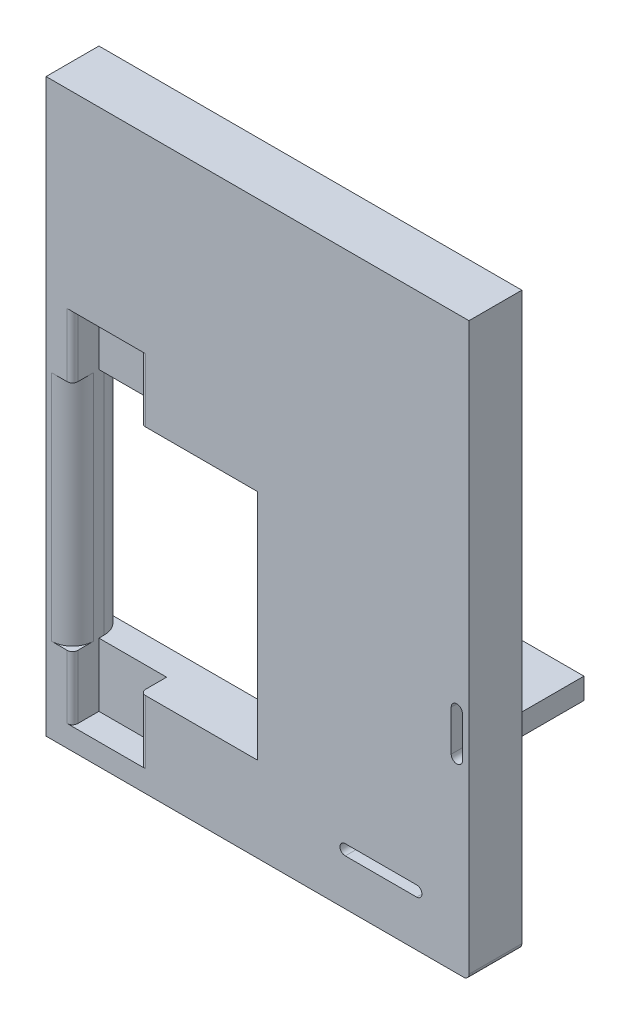
ISO-10303-21;
HEADER;
FILE_DESCRIPTION(('STEP AP214'),'2;1');
FILE_NAME('part.step','',(''),(''),'','','');
FILE_SCHEMA(('AUTOMOTIVE_DESIGN { 1 0 10303 214 1 1 1 1 }'));
ENDSEC;
DATA;
#1=APPLICATION_CONTEXT('core data for automotive mechanical design processes');
#2=APPLICATION_PROTOCOL_DEFINITION('international standard','automotive_design',2000,#1);
#3=PRODUCT_CONTEXT('',#1,'mechanical');
#4=PRODUCT('Part','Part','',(#3));
#5=PRODUCT_RELATED_PRODUCT_CATEGORY('part','',(#4));
#6=PRODUCT_DEFINITION_FORMATION('','',#4);
#7=PRODUCT_DEFINITION_CONTEXT('part definition',#1,'design');
#8=PRODUCT_DEFINITION('design','',#6,#7);
#9=PRODUCT_DEFINITION_SHAPE('','',#8);
#10=(LENGTH_UNIT() NAMED_UNIT(*) SI_UNIT(.MILLI.,.METRE.));
#11=(NAMED_UNIT(*) PLANE_ANGLE_UNIT() SI_UNIT($,.RADIAN.));
#12=(NAMED_UNIT(*) SI_UNIT($,.STERADIAN.) SOLID_ANGLE_UNIT());
#13=UNCERTAINTY_MEASURE_WITH_UNIT(LENGTH_MEASURE(1.E-05),#10,'distance_accuracy_value','');
#14=(GEOMETRIC_REPRESENTATION_CONTEXT(3) GLOBAL_UNCERTAINTY_ASSIGNED_CONTEXT((#13)) GLOBAL_UNIT_ASSIGNED_CONTEXT((#10,
#11,#12)) REPRESENTATION_CONTEXT('',''));
#15=CARTESIAN_POINT('',(0.,0.,0.));
#16=DIRECTION('',(0.,0.,1.));
#17=DIRECTION('',(1.,0.,0.));
#18=AXIS2_PLACEMENT_3D('',#15,#16,#17);
#19=CARTESIAN_POINT('',(0.,0.,0.));
#20=DIRECTION('',(0.,0.,-1.));
#21=DIRECTION('',(-1.,0.,0.));
#22=AXIS2_PLACEMENT_3D('',#19,#20,#21);
#23=PLANE('',#22);
#24=CARTESIAN_POINT('',(75.2670888522956,-125.945469049431,0.));
#25=DIRECTION('',(0.,0.,-1.));
#26=DIRECTION('',(-1.,0.,0.));
#27=AXIS2_PLACEMENT_3D('',#24,#25,#26);
#28=CIRCLE('',#27,2.5);
#29=CARTESIAN_POINT('',(75.2670888522956,-123.445469049431,0.));
#30=VERTEX_POINT('',#29);
#31=CARTESIAN_POINT('',(75.2670888522956,-128.445469049431,0.));
#32=VERTEX_POINT('',#31);
#33=EDGE_CURVE('E61',#30,#32,#28,.T.);
#34=ORIENTED_EDGE('',*,*,#33,.F.);
#35=DIRECTION('',(1.,0.,0.));
#36=VECTOR('',#35,1.);
#37=CARTESIAN_POINT('',(75.2670888522956,-123.445469049431,0.));
#38=LINE('',#37,#36);
#39=CARTESIAN_POINT('',(41.4919387106455,-123.445469049431,0.));
#40=VERTEX_POINT('',#39);
#41=EDGE_CURVE('E293',#40,#30,#38,.T.);
#42=ORIENTED_EDGE('',*,*,#41,.F.);
#43=CARTESIAN_POINT('',(41.4919387106455,-125.945469049431,0.));
#44=DIRECTION('',(0.,0.,-1.));
#45=DIRECTION('',(-1.,0.,0.));
#46=AXIS2_PLACEMENT_3D('',#43,#44,#45);
#47=CIRCLE('',#46,2.5);
#48=CARTESIAN_POINT('',(41.4919387106455,-128.445469049431,0.));
#49=VERTEX_POINT('',#48);
#50=EDGE_CURVE('E276',#49,#40,#47,.T.);
#51=ORIENTED_EDGE('',*,*,#50,.F.);
#52=DIRECTION('',(-1.,0.,0.));
#53=VECTOR('',#52,1.);
#54=CARTESIAN_POINT('',(75.2670888522956,-128.445469049431,0.));
#55=LINE('',#54,#53);
#56=EDGE_CURVE('E286',#32,#49,#55,.T.);
#57=ORIENTED_EDGE('',*,*,#56,.F.);
#58=EDGE_LOOP('',(#34,#42,#51,#57));
#59=FACE_BOUND('',#58,.T.);
#60=CARTESIAN_POINT('',(94.2568313407574,-42.4693194311734,0.));
#61=DIRECTION('',(0.,0.,-1.));
#62=DIRECTION('',(-1.,0.,0.));
#63=AXIS2_PLACEMENT_3D('',#60,#61,#62);
#64=CIRCLE('',#63,2.6592924538406);
#65=CARTESIAN_POINT('',(91.5975388869168,-42.4693194311734,0.));
#66=VERTEX_POINT('',#65);
#67=CARTESIAN_POINT('',(96.916123794598,-42.4693194311734,0.));
#68=VERTEX_POINT('',#67);
#69=EDGE_CURVE('E303',#66,#68,#64,.T.);
#70=ORIENTED_EDGE('',*,*,#69,.F.);
#71=DIRECTION('',(0.,1.,0.));
#72=VECTOR('',#71,1.);
#73=CARTESIAN_POINT('',(91.5975388869168,-42.4693194311734,0.));
#74=LINE('',#73,#72);
#75=CARTESIAN_POINT('',(91.5975388869168,-61.7491897215178,0.));
#76=VERTEX_POINT('',#75);
#77=EDGE_CURVE('E318',#76,#66,#74,.T.);
#78=ORIENTED_EDGE('',*,*,#77,.F.);
#79=CARTESIAN_POINT('',(94.2568313407574,-61.7491897215178,0.));
#80=DIRECTION('',(0.,0.,-1.));
#81=DIRECTION('',(-1.,0.,0.));
#82=AXIS2_PLACEMENT_3D('',#79,#80,#81);
#83=CIRCLE('',#82,2.6592924538406);
#84=CARTESIAN_POINT('',(96.916123794598,-61.7491897215178,0.));
#85=VERTEX_POINT('',#84);
#86=EDGE_CURVE('E314',#85,#76,#83,.T.);
#87=ORIENTED_EDGE('',*,*,#86,.F.);
#88=DIRECTION('',(0.,-1.,0.));
#89=VECTOR('',#88,1.);
#90=CARTESIAN_POINT('',(96.916123794598,-42.4693194311734,0.));
#91=LINE('',#90,#89);
#92=EDGE_CURVE('E310',#68,#85,#91,.T.);
#93=ORIENTED_EDGE('',*,*,#92,.F.);
#94=EDGE_LOOP('',(#70,#78,#87,#93));
#95=FACE_BOUND('',#94,.T.);
#96=DIRECTION('',(0.,-1.,0.));
#97=VECTOR('',#96,1.);
#98=CARTESIAN_POINT('',(-97.5,-110.,0.));
#99=LINE('',#98,#97);
#100=CARTESIAN_POINT('',(-97.5,0.,0.));
#101=VERTEX_POINT('',#100);
#102=CARTESIAN_POINT('',(-97.5,-110.,0.));
#103=VERTEX_POINT('',#102);
#104=EDGE_CURVE('E539',#101,#103,#99,.T.);
#105=ORIENTED_EDGE('',*,*,#104,.T.);
#106=DIRECTION('',(1.,0.,0.));
#107=VECTOR('',#106,1.);
#108=CARTESIAN_POINT('',(0.,-110.,0.));
#109=LINE('',#108,#107);
#110=CARTESIAN_POINT('',(0.,-110.,0.));
#111=VERTEX_POINT('',#110);
#112=EDGE_CURVE('E464',#103,#111,#109,.T.);
#113=ORIENTED_EDGE('',*,*,#112,.T.);
#114=DIRECTION('',(0.,1.,0.));
#115=VECTOR('',#114,1.);
#116=CARTESIAN_POINT('',(0.,0.,0.));
#117=LINE('',#116,#115);
#118=CARTESIAN_POINT('',(0.,0.,0.));
#119=VERTEX_POINT('',#118);
#120=EDGE_CURVE('E456',#111,#119,#117,.T.);
#121=ORIENTED_EDGE('',*,*,#120,.T.);
#122=DIRECTION('',(-1.,0.,0.));
#123=VECTOR('',#122,1.);
#124=CARTESIAN_POINT('',(0.,0.,0.));
#125=LINE('',#124,#123);
#126=EDGE_CURVE('E460',#119,#101,#125,.T.);
#127=ORIENTED_EDGE('',*,*,#126,.T.);
#128=EDGE_LOOP('',(#105,#113,#121,#127));
#129=FACE_BOUND('',#128,.T.);
#130=DIRECTION('',(0.,1.,0.));
#131=VECTOR('',#130,1.);
#132=CARTESIAN_POINT('',(100.,-120.,0.));
#133=LINE('',#132,#131);
#134=CARTESIAN_POINT('',(100.,-147.664162566349,0.));
#135=VERTEX_POINT('',#134);
#136=CARTESIAN_POINT('',(100.,120.,0.));
#137=VERTEX_POINT('',#136);
#138=EDGE_CURVE('E500',#135,#137,#133,.T.);
#139=ORIENTED_EDGE('',*,*,#138,.F.);
#140=CARTESIAN_POINT('',(97.5,-147.664162566349,0.));
#141=DIRECTION('',(0.,0.,-1.));
#142=DIRECTION('',(-1.,0.,0.));
#143=AXIS2_PLACEMENT_3D('',#140,#141,#142);
#144=CIRCLE('',#143,2.5);
#145=CARTESIAN_POINT('',(97.5,-150.164162566349,0.));
#146=VERTEX_POINT('',#145);
#147=EDGE_CURVE('E591',#135,#146,#144,.T.);
#148=ORIENTED_EDGE('',*,*,#147,.T.);
#149=DIRECTION('',(1.,0.,0.));
#150=VECTOR('',#149,1.);
#151=CARTESIAN_POINT('',(-100.,-150.164162566349,0.));
#152=LINE('',#151,#150);
#153=CARTESIAN_POINT('',(-100.,-150.164162566349,0.));
#154=VERTEX_POINT('',#153);
#155=EDGE_CURVE('E444',#154,#146,#152,.T.);
#156=ORIENTED_EDGE('',*,*,#155,.F.);
#157=DIRECTION('',(0.,1.,0.));
#158=VECTOR('',#157,1.);
#159=CARTESIAN_POINT('',(-100.,-120.,0.));
#160=LINE('',#159,#158);
#161=CARTESIAN_POINT('',(-100.,120.,0.));
#162=VERTEX_POINT('',#161);
#163=EDGE_CURVE('E511',#154,#162,#160,.T.);
#164=ORIENTED_EDGE('',*,*,#163,.T.);
#165=DIRECTION('',(-1.,0.,0.));
#166=VECTOR('',#165,1.);
#167=CARTESIAN_POINT('',(100.,120.,0.));
#168=LINE('',#167,#166);
#169=EDGE_CURVE('E484',#137,#162,#168,.T.);
#170=ORIENTED_EDGE('',*,*,#169,.F.);
#171=EDGE_LOOP('',(#139,#148,#156,#164,#170));
#172=FACE_BOUND('',#171,.T.);
#173=DIRECTION('',(-1.,0.,0.));
#174=VECTOR('',#173,1.);
#175=CARTESIAN_POINT('',(89.3674545266771,-73.3939838192922,0.));
#176=LINE('',#175,#174);
#177=CARTESIAN_POINT('',(89.3674545266771,-73.3939838192922,0.));
#178=VERTEX_POINT('',#177);
#179=CARTESIAN_POINT('',(16.6490819522243,-73.3939838192922,0.));
#180=VERTEX_POINT('',#179);
#181=EDGE_CURVE('E354',#178,#180,#176,.T.);
#182=ORIENTED_EDGE('',*,*,#181,.F.);
#183=DIRECTION('',(0.,-1.,0.));
#184=VECTOR('',#183,1.);
#185=CARTESIAN_POINT('',(89.3674545266771,-63.3939838192922,0.));
#186=LINE('',#185,#184);
#187=CARTESIAN_POINT('',(89.3674545266771,-63.3939838192922,0.));
#188=VERTEX_POINT('',#187);
#189=EDGE_CURVE('E326',#188,#178,#186,.T.);
#190=ORIENTED_EDGE('',*,*,#189,.F.);
#191=DIRECTION('',(1.,0.,0.));
#192=VECTOR('',#191,1.);
#193=CARTESIAN_POINT('',(89.3674545266771,-63.3939838192922,0.));
#194=LINE('',#193,#192);
#195=CARTESIAN_POINT('',(16.6490819522243,-63.3939838192922,0.));
#196=VERTEX_POINT('',#195);
#197=EDGE_CURVE('E341',#196,#188,#194,.T.);
#198=ORIENTED_EDGE('',*,*,#197,.F.);
#199=DIRECTION('',(0.,1.,0.));
#200=VECTOR('',#199,1.);
#201=CARTESIAN_POINT('',(16.6490819522243,-63.3939838192922,0.));
#202=LINE('',#201,#200);
#203=EDGE_CURVE('E357',#180,#196,#202,.T.);
#204=ORIENTED_EDGE('',*,*,#203,.F.);
#205=EDGE_LOOP('',(#182,#190,#198,#204));
#206=FACE_BOUND('',#205,.T.);
#207=ADVANCED_FACE('F45',(#59,#95,#129,#172,#206),#23,.T.);
#208=CARTESIAN_POINT('',(0.,0.,25.));
#209=DIRECTION('',(0.,0.,-1.));
#210=DIRECTION('',(-1.,0.,0.));
#211=AXIS2_PLACEMENT_3D('',#208,#209,#210);
#212=PLANE('',#211);
#213=DIRECTION('',(1.,0.,0.));
#214=VECTOR('',#213,1.);
#215=CARTESIAN_POINT('',(0.,-123.445469049431,25.));
#216=LINE('',#215,#214);
#217=CARTESIAN_POINT('',(41.4919387106455,-123.445469049431,25.));
#218=VERTEX_POINT('',#217);
#219=CARTESIAN_POINT('',(75.2670888522956,-123.445469049431,25.));
#220=VERTEX_POINT('',#219);
#221=EDGE_CURVE('E54',#218,#220,#216,.T.);
#222=ORIENTED_EDGE('',*,*,#221,.T.);
#223=CARTESIAN_POINT('',(75.2670888522956,-125.945469049431,25.));
#224=DIRECTION('',(0.,0.,-1.));
#225=DIRECTION('',(-1.,0.,0.));
#226=AXIS2_PLACEMENT_3D('',#223,#224,#225);
#227=CIRCLE('',#226,2.5);
#228=CARTESIAN_POINT('',(75.2670888522956,-128.445469049431,25.));
#229=VERTEX_POINT('',#228);
#230=EDGE_CURVE('E11',#220,#229,#227,.T.);
#231=ORIENTED_EDGE('',*,*,#230,.T.);
#232=DIRECTION('',(-1.,0.,0.));
#233=VECTOR('',#232,1.);
#234=CARTESIAN_POINT('',(0.,-128.445469049431,25.));
#235=LINE('',#234,#233);
#236=CARTESIAN_POINT('',(41.4919387106455,-128.445469049431,25.));
#237=VERTEX_POINT('',#236);
#238=EDGE_CURVE('E637',#229,#237,#235,.T.);
#239=ORIENTED_EDGE('',*,*,#238,.T.);
#240=CARTESIAN_POINT('',(41.4919387106455,-125.945469049431,25.));
#241=DIRECTION('',(0.,0.,-1.));
#242=DIRECTION('',(-1.,0.,0.));
#243=AXIS2_PLACEMENT_3D('',#240,#241,#242);
#244=CIRCLE('',#243,2.5);
#245=EDGE_CURVE('E279',#237,#218,#244,.T.);
#246=ORIENTED_EDGE('',*,*,#245,.T.);
#247=EDGE_LOOP('',(#222,#231,#239,#246));
#248=FACE_BOUND('',#247,.T.);
#249=DIRECTION('',(0.,1.,0.));
#250=VECTOR('',#249,1.);
#251=CARTESIAN_POINT('',(91.5975388869168,0.,25.));
#252=LINE('',#251,#250);
#253=CARTESIAN_POINT('',(91.5975388869168,-61.7491897215178,25.));
#254=VERTEX_POINT('',#253);
#255=CARTESIAN_POINT('',(91.5975388869168,-42.4693194311734,25.));
#256=VERTEX_POINT('',#255);
#257=EDGE_CURVE('E629',#254,#256,#252,.T.);
#258=ORIENTED_EDGE('',*,*,#257,.T.);
#259=CARTESIAN_POINT('',(94.2568313407574,-42.4693194311734,25.));
#260=DIRECTION('',(0.,0.,-1.));
#261=DIRECTION('',(-1.,0.,0.));
#262=AXIS2_PLACEMENT_3D('',#259,#260,#261);
#263=CIRCLE('',#262,2.6592924538406);
#264=CARTESIAN_POINT('',(96.916123794598,-42.4693194311734,25.));
#265=VERTEX_POINT('',#264);
#266=EDGE_CURVE('E633',#256,#265,#263,.T.);
#267=ORIENTED_EDGE('',*,*,#266,.T.);
#268=DIRECTION('',(0.,-1.,0.));
#269=VECTOR('',#268,1.);
#270=CARTESIAN_POINT('',(96.916123794598,0.,25.));
#271=LINE('',#270,#269);
#272=CARTESIAN_POINT('',(96.916123794598,-61.7491897215178,25.));
#273=VERTEX_POINT('',#272);
#274=EDGE_CURVE('E621',#265,#273,#271,.T.);
#275=ORIENTED_EDGE('',*,*,#274,.T.);
#276=CARTESIAN_POINT('',(94.2568313407574,-61.7491897215178,25.));
#277=DIRECTION('',(0.,0.,-1.));
#278=DIRECTION('',(-1.,0.,0.));
#279=AXIS2_PLACEMENT_3D('',#276,#277,#278);
#280=CIRCLE('',#279,2.6592924538406);
#281=EDGE_CURVE('E625',#273,#254,#280,.T.);
#282=ORIENTED_EDGE('',*,*,#281,.T.);
#283=EDGE_LOOP('',(#258,#267,#275,#282));
#284=FACE_BOUND('',#283,.T.);
#285=DIRECTION('',(1.,0.,0.));
#286=VECTOR('',#285,1.);
#287=CARTESIAN_POINT('',(-100.,-150.164162566349,25.));
#288=LINE('',#287,#286);
#289=CARTESIAN_POINT('',(-100.,-150.164162566349,25.));
#290=VERTEX_POINT('',#289);
#291=CARTESIAN_POINT('',(97.5,-150.164162566349,25.));
#292=VERTEX_POINT('',#291);
#293=EDGE_CURVE('E432',#290,#292,#288,.T.);
#294=ORIENTED_EDGE('',*,*,#293,.T.);
#295=CARTESIAN_POINT('',(97.5,-147.664162566349,25.));
#296=DIRECTION('',(0.,0.,-1.));
#297=DIRECTION('',(-1.,0.,0.));
#298=AXIS2_PLACEMENT_3D('',#295,#296,#297);
#299=CIRCLE('',#298,2.5);
#300=CARTESIAN_POINT('',(100.,-147.664162566349,25.));
#301=VERTEX_POINT('',#300);
#302=EDGE_CURVE('E585',#292,#301,#299,.F.);
#303=ORIENTED_EDGE('',*,*,#302,.T.);
#304=DIRECTION('',(0.,1.,0.));
#305=VECTOR('',#304,1.);
#306=CARTESIAN_POINT('',(100.,-120.,25.));
#307=LINE('',#306,#305);
#308=CARTESIAN_POINT('',(100.,120.,25.));
#309=VERTEX_POINT('',#308);
#310=EDGE_CURVE('E504',#301,#309,#307,.T.);
#311=ORIENTED_EDGE('',*,*,#310,.T.);
#312=DIRECTION('',(-1.,0.,0.));
#313=VECTOR('',#312,1.);
#314=CARTESIAN_POINT('',(100.,120.,25.));
#315=LINE('',#314,#313);
#316=CARTESIAN_POINT('',(-100.,120.,25.));
#317=VERTEX_POINT('',#316);
#318=EDGE_CURVE('E496',#309,#317,#315,.T.);
#319=ORIENTED_EDGE('',*,*,#318,.T.);
#320=DIRECTION('',(0.,1.,0.));
#321=VECTOR('',#320,1.);
#322=CARTESIAN_POINT('',(-100.,-120.,25.));
#323=LINE('',#322,#321);
#324=EDGE_CURVE('E499',#290,#317,#323,.T.);
#325=ORIENTED_EDGE('',*,*,#324,.F.);
#326=EDGE_LOOP('',(#294,#303,#311,#319,#325));
#327=FACE_BOUND('',#326,.T.);
#328=DIRECTION('',(1.,0.,0.));
#329=VECTOR('',#328,1.);
#330=CARTESIAN_POINT('',(-87.5,30.,25.));
#331=LINE('',#330,#329);
#332=CARTESIAN_POINT('',(-90.,30.,25.));
#333=VERTEX_POINT('',#332);
#334=CARTESIAN_POINT('',(-53.,30.,25.));
#335=VERTEX_POINT('',#334);
#336=EDGE_CURVE('E376',#333,#335,#331,.T.);
#337=ORIENTED_EDGE('',*,*,#336,.T.);
#338=DIRECTION('',(0.,-1.,0.));
#339=VECTOR('',#338,1.);
#340=CARTESIAN_POINT('',(-53.,0.,25.));
#341=LINE('',#340,#339);
#342=CARTESIAN_POINT('',(-53.,0.,25.));
#343=VERTEX_POINT('',#342);
#344=EDGE_CURVE('E598',#335,#343,#341,.T.);
#345=ORIENTED_EDGE('',*,*,#344,.T.);
#346=DIRECTION('',(-1.,0.,0.));
#347=VECTOR('',#346,1.);
#348=CARTESIAN_POINT('',(0.,0.,25.));
#349=LINE('',#348,#347);
#350=CARTESIAN_POINT('',(0.,0.,25.));
#351=VERTEX_POINT('',#350);
#352=EDGE_CURVE('E472',#351,#343,#349,.T.);
#353=ORIENTED_EDGE('',*,*,#352,.F.);
#354=DIRECTION('',(0.,1.,0.));
#355=VECTOR('',#354,1.);
#356=CARTESIAN_POINT('',(0.,0.,25.));
#357=LINE('',#356,#355);
#358=CARTESIAN_POINT('',(0.,-110.,25.));
#359=VERTEX_POINT('',#358);
#360=EDGE_CURVE('E455',#359,#351,#357,.T.);
#361=ORIENTED_EDGE('',*,*,#360,.F.);
#362=DIRECTION('',(1.,0.,0.));
#363=VECTOR('',#362,1.);
#364=CARTESIAN_POINT('',(0.,-110.,25.));
#365=LINE('',#364,#363);
#366=CARTESIAN_POINT('',(-53.,-110.,25.));
#367=VERTEX_POINT('',#366);
#368=EDGE_CURVE('E476',#367,#359,#365,.T.);
#369=ORIENTED_EDGE('',*,*,#368,.F.);
#370=DIRECTION('',(0.,1.,0.));
#371=VECTOR('',#370,1.);
#372=CARTESIAN_POINT('',(-53.,0.,25.));
#373=LINE('',#372,#371);
#374=CARTESIAN_POINT('',(-53.,-140.,25.));
#375=VERTEX_POINT('',#374);
#376=EDGE_CURVE('E574',#367,#375,#373,.F.);
#377=ORIENTED_EDGE('',*,*,#376,.T.);
#378=DIRECTION('',(1.,0.,0.));
#379=VECTOR('',#378,1.);
#380=CARTESIAN_POINT('',(-87.5,-140.,25.));
#381=LINE('',#380,#379);
#382=CARTESIAN_POINT('',(-90.,-140.,25.));
#383=VERTEX_POINT('',#382);
#384=EDGE_CURVE('E398',#383,#375,#381,.T.);
#385=ORIENTED_EDGE('',*,*,#384,.F.);
#386=DIRECTION('',(0.,-1.,0.));
#387=VECTOR('',#386,1.);
#388=CARTESIAN_POINT('',(-90.,0.,25.));
#389=LINE('',#388,#387);
#390=CARTESIAN_POINT('',(-90.,-110.,25.));
#391=VERTEX_POINT('',#390);
#392=EDGE_CURVE('E557',#383,#391,#389,.F.);
#393=ORIENTED_EDGE('',*,*,#392,.T.);
#394=CARTESIAN_POINT('',(-97.5,-110.,25.));
#395=VERTEX_POINT('',#394);
#396=EDGE_CURVE('E461',#395,#391,#365,.T.);
#397=ORIENTED_EDGE('',*,*,#396,.F.);
#398=DIRECTION('',(0.,-1.,0.));
#399=VECTOR('',#398,1.);
#400=CARTESIAN_POINT('',(-97.5,0.,25.));
#401=LINE('',#400,#399);
#402=CARTESIAN_POINT('',(-97.5,0.,25.));
#403=VERTEX_POINT('',#402);
#404=EDGE_CURVE('E527',#395,#403,#401,.F.);
#405=ORIENTED_EDGE('',*,*,#404,.T.);
#406=CARTESIAN_POINT('',(-90.,0.,25.));
#407=VERTEX_POINT('',#406);
#408=EDGE_CURVE('E471',#407,#403,#349,.T.);
#409=ORIENTED_EDGE('',*,*,#408,.F.);
#410=DIRECTION('',(0.,1.,0.));
#411=VECTOR('',#410,1.);
#412=CARTESIAN_POINT('',(-90.,0.,25.));
#413=LINE('',#412,#411);
#414=EDGE_CURVE('E594',#407,#333,#413,.T.);
#415=ORIENTED_EDGE('',*,*,#414,.T.);
#416=EDGE_LOOP('',(#337,#345,#353,#361,#369,#377,#385,#393,#397,#405,#409,#415));
#417=FACE_BOUND('',#416,.T.);
#418=ADVANCED_FACE('F644',(#248,#284,#327,#417),#212,.F.);
#419=CARTESIAN_POINT('',(0.,0.,0.));
#420=DIRECTION('',(0.,1.,0.));
#421=DIRECTION('',(-1.,0.,0.));
#422=AXIS2_PLACEMENT_3D('',#419,#420,#421);
#423=PLANE('',#422);
#424=DIRECTION('',(0.,0.,1.));
#425=VECTOR('',#424,1.);
#426=CARTESIAN_POINT('',(-87.5,0.,12.5));
#427=LINE('',#426,#425);
#428=CARTESIAN_POINT('',(-87.5,0.,15.));
#429=VERTEX_POINT('',#428);
#430=CARTESIAN_POINT('',(-87.5,0.,22.5));
#431=VERTEX_POINT('',#430);
#432=EDGE_CURVE('E391',#429,#431,#427,.T.);
#433=ORIENTED_EDGE('',*,*,#432,.T.);
#434=CARTESIAN_POINT('',(-90.,0.,22.5));
#435=DIRECTION('',(0.,1.,0.));
#436=DIRECTION('',(-1.,0.,0.));
#437=AXIS2_PLACEMENT_3D('',#434,#435,#436);
#438=CIRCLE('',#437,2.5);
#439=EDGE_CURVE('E611',#431,#407,#438,.F.);
#440=ORIENTED_EDGE('',*,*,#439,.T.);
#441=ORIENTED_EDGE('',*,*,#408,.T.);
#442=CARTESIAN_POINT('',(-97.5,0.,15.));
#443=DIRECTION('',(0.,1.,0.));
#444=DIRECTION('',(-1.,0.,0.));
#445=AXIS2_PLACEMENT_3D('',#442,#443,#444);
#446=CIRCLE('',#445,10.);
#447=EDGE_CURVE('E535',#403,#429,#446,.T.);
#448=ORIENTED_EDGE('',*,*,#447,.T.);
#449=EDGE_LOOP('',(#433,#440,#441,#448));
#450=FACE_BOUND('',#449,.T.);
#451=ADVANCED_FACE('F668',(#450),#423,.F.);
#452=ORIENTED_EDGE('',*,*,#352,.T.);
#453=CARTESIAN_POINT('',(-53.,0.,22.5));
#454=DIRECTION('',(0.,1.,0.));
#455=DIRECTION('',(-1.,0.,0.));
#456=AXIS2_PLACEMENT_3D('',#453,#454,#455);
#457=CIRCLE('',#456,2.5);
#458=CARTESIAN_POINT('',(-55.5,0.,22.5));
#459=VERTEX_POINT('',#458);
#460=EDGE_CURVE('E602',#343,#459,#457,.F.);
#461=ORIENTED_EDGE('',*,*,#460,.T.);
#462=DIRECTION('',(0.,0.,1.));
#463=VECTOR('',#462,1.);
#464=CARTESIAN_POINT('',(-55.5,0.,12.5));
#465=LINE('',#464,#463);
#466=CARTESIAN_POINT('',(-55.5,0.,12.5));
#467=VERTEX_POINT('',#466);
#468=EDGE_CURVE('E403',#467,#459,#465,.T.);
#469=ORIENTED_EDGE('',*,*,#468,.F.);
#470=DIRECTION('',(-1.,0.,0.));
#471=VECTOR('',#470,1.);
#472=CARTESIAN_POINT('',(-87.5,0.,12.5));
#473=LINE('',#472,#471);
#474=CARTESIAN_POINT('',(-87.5,0.,12.5));
#475=VERTEX_POINT('',#474);
#476=EDGE_CURVE('E381',#467,#475,#473,.T.);
#477=ORIENTED_EDGE('',*,*,#476,.T.);
#478=DIRECTION('',(0.,0.,1.));
#479=VECTOR('',#478,1.);
#480=CARTESIAN_POINT('',(-87.5,0.,0.));
#481=LINE('',#480,#479);
#482=CARTESIAN_POINT('',(-87.5,0.,10.));
#483=VERTEX_POINT('',#482);
#484=EDGE_CURVE('E489',#483,#475,#481,.T.);
#485=ORIENTED_EDGE('',*,*,#484,.F.);
#486=CARTESIAN_POINT('',(-97.5,0.,10.));
#487=DIRECTION('',(0.,1.,0.));
#488=DIRECTION('',(-1.,0.,0.));
#489=AXIS2_PLACEMENT_3D('',#486,#487,#488);
#490=CIRCLE('',#489,10.);
#491=EDGE_CURVE('E549',#483,#101,#490,.T.);
#492=ORIENTED_EDGE('',*,*,#491,.T.);
#493=ORIENTED_EDGE('',*,*,#126,.F.);
#494=DIRECTION('',(0.,0.,1.));
#495=VECTOR('',#494,1.);
#496=CARTESIAN_POINT('',(0.,0.,0.));
#497=LINE('',#496,#495);
#498=EDGE_CURVE('E468',#119,#351,#497,.T.);
#499=ORIENTED_EDGE('',*,*,#498,.T.);
#500=EDGE_LOOP('',(#452,#461,#469,#477,#485,#492,#493,#499));
#501=FACE_BOUND('',#500,.T.);
#502=ADVANCED_FACE('F739',(#501),#423,.F.);
#503=CARTESIAN_POINT('',(0.,-110.,0.));
#504=DIRECTION('',(0.,-1.,0.));
#505=DIRECTION('',(1.,0.,0.));
#506=AXIS2_PLACEMENT_3D('',#503,#504,#505);
#507=PLANE('',#506);
#508=ORIENTED_EDGE('',*,*,#396,.T.);
#509=CARTESIAN_POINT('',(-90.,-110.,22.5));
#510=DIRECTION('',(0.,-1.,0.));
#511=DIRECTION('',(1.,0.,0.));
#512=AXIS2_PLACEMENT_3D('',#509,#510,#511);
#513=CIRCLE('',#512,2.5);
#514=CARTESIAN_POINT('',(-87.5,-110.,22.5));
#515=VERTEX_POINT('',#514);
#516=EDGE_CURVE('E560',#391,#515,#513,.F.);
#517=ORIENTED_EDGE('',*,*,#516,.T.);
#518=DIRECTION('',(0.,0.,1.));
#519=VECTOR('',#518,1.);
#520=CARTESIAN_POINT('',(-87.5,-110.,12.5));
#521=LINE('',#520,#519);
#522=CARTESIAN_POINT('',(-87.5,-110.,15.));
#523=VERTEX_POINT('',#522);
#524=EDGE_CURVE('E428',#523,#515,#521,.T.);
#525=ORIENTED_EDGE('',*,*,#524,.F.);
#526=CARTESIAN_POINT('',(-97.5,-110.,15.));
#527=DIRECTION('',(0.,-1.,0.));
#528=DIRECTION('',(1.,0.,0.));
#529=AXIS2_PLACEMENT_3D('',#526,#527,#528);
#530=CIRCLE('',#529,10.);
#531=EDGE_CURVE('E531',#523,#395,#530,.T.);
#532=ORIENTED_EDGE('',*,*,#531,.T.);
#533=EDGE_LOOP('',(#508,#517,#525,#532));
#534=FACE_BOUND('',#533,.T.);
#535=ADVANCED_FACE('F684',(#534),#507,.F.);
#536=CARTESIAN_POINT('',(100.,120.,25.));
#537=DIRECTION('',(0.,-1.,0.));
#538=DIRECTION('',(1.,0.,0.));
#539=AXIS2_PLACEMENT_3D('',#536,#537,#538);
#540=PLANE('',#539);
#541=ORIENTED_EDGE('',*,*,#169,.T.);
#542=DIRECTION('',(0.,0.,-1.));
#543=VECTOR('',#542,1.);
#544=CARTESIAN_POINT('',(-100.,120.,25.));
#545=LINE('',#544,#543);
#546=EDGE_CURVE('E520',#317,#162,#545,.T.);
#547=ORIENTED_EDGE('',*,*,#546,.F.);
#548=ORIENTED_EDGE('',*,*,#318,.F.);
#549=DIRECTION('',(0.,0.,-1.));
#550=VECTOR('',#549,1.);
#551=CARTESIAN_POINT('',(100.,120.,25.));
#552=LINE('',#551,#550);
#553=EDGE_CURVE('E507',#309,#137,#552,.T.);
#554=ORIENTED_EDGE('',*,*,#553,.T.);
#555=EDGE_LOOP('',(#541,#547,#548,#554));
#556=FACE_BOUND('',#555,.T.);
#557=ADVANCED_FACE('F680',(#556),#540,.F.);
#558=CARTESIAN_POINT('',(-100.,-120.,25.));
#559=DIRECTION('',(-1.,0.,0.));
#560=DIRECTION('',(0.,0.,1.));
#561=AXIS2_PLACEMENT_3D('',#558,#559,#560);
#562=PLANE('',#561);
#563=ORIENTED_EDGE('',*,*,#163,.F.);
#564=DIRECTION('',(0.,0.,1.));
#565=VECTOR('',#564,1.);
#566=CARTESIAN_POINT('',(-100.,-150.164162566349,0.));
#567=LINE('',#566,#565);
#568=EDGE_CURVE('E448',#154,#290,#567,.T.);
#569=ORIENTED_EDGE('',*,*,#568,.T.);
#570=ORIENTED_EDGE('',*,*,#324,.T.);
#571=ORIENTED_EDGE('',*,*,#546,.T.);
#572=EDGE_LOOP('',(#563,#569,#570,#571));
#573=FACE_BOUND('',#572,.T.);
#574=ADVANCED_FACE('F676',(#573),#562,.T.);
#575=CARTESIAN_POINT('',(100.,-120.,25.));
#576=DIRECTION('',(-1.,0.,0.));
#577=DIRECTION('',(0.,0.,1.));
#578=AXIS2_PLACEMENT_3D('',#575,#576,#577);
#579=PLANE('',#578);
#580=ORIENTED_EDGE('',*,*,#310,.F.);
#581=DIRECTION('',(0.,0.,1.));
#582=VECTOR('',#581,1.);
#583=CARTESIAN_POINT('',(100.,-147.664162566349,0.));
#584=LINE('',#583,#582);
#585=EDGE_CURVE('E588',#301,#135,#584,.F.);
#586=ORIENTED_EDGE('',*,*,#585,.T.);
#587=ORIENTED_EDGE('',*,*,#138,.T.);
#588=ORIENTED_EDGE('',*,*,#553,.F.);
#589=EDGE_LOOP('',(#580,#586,#587,#588));
#590=FACE_BOUND('',#589,.T.);
#591=ADVANCED_FACE('F672',(#590),#579,.F.);
#592=CARTESIAN_POINT('',(0.,0.,0.));
#593=DIRECTION('',(1.,0.,0.));
#594=DIRECTION('',(0.,1.,0.));
#595=AXIS2_PLACEMENT_3D('',#592,#593,#594);
#596=PLANE('',#595);
#597=ORIENTED_EDGE('',*,*,#360,.T.);
#598=ORIENTED_EDGE('',*,*,#498,.F.);
#599=ORIENTED_EDGE('',*,*,#120,.F.);
#600=DIRECTION('',(0.,0.,1.));
#601=VECTOR('',#600,1.);
#602=CARTESIAN_POINT('',(0.,-110.,0.));
#603=LINE('',#602,#601);
#604=EDGE_CURVE('E480',#111,#359,#603,.T.);
#605=ORIENTED_EDGE('',*,*,#604,.T.);
#606=EDGE_LOOP('',(#597,#598,#599,#605));
#607=FACE_BOUND('',#606,.T.);
#608=ADVANCED_FACE('F675',(#607),#596,.F.);
#609=DIRECTION('',(0.,0.,1.));
#610=VECTOR('',#609,1.);
#611=CARTESIAN_POINT('',(-55.5,-110.,12.5));
#612=LINE('',#611,#610);
#613=CARTESIAN_POINT('',(-55.5,-110.,12.5));
#614=VERTEX_POINT('',#613);
#615=CARTESIAN_POINT('',(-55.5,-110.,22.5));
#616=VERTEX_POINT('',#615);
#617=EDGE_CURVE('E433',#614,#616,#612,.T.);
#618=ORIENTED_EDGE('',*,*,#617,.T.);
#619=CARTESIAN_POINT('',(-53.,-110.,22.5));
#620=DIRECTION('',(0.,-1.,0.));
#621=DIRECTION('',(1.,0.,0.));
#622=AXIS2_PLACEMENT_3D('',#619,#620,#621);
#623=CIRCLE('',#622,2.5);
#624=EDGE_CURVE('E571',#616,#367,#623,.F.);
#625=ORIENTED_EDGE('',*,*,#624,.T.);
#626=ORIENTED_EDGE('',*,*,#368,.T.);
#627=ORIENTED_EDGE('',*,*,#604,.F.);
#628=ORIENTED_EDGE('',*,*,#112,.F.);
#629=CARTESIAN_POINT('',(-97.5,-110.,10.));
#630=DIRECTION('',(0.,-1.,0.));
#631=DIRECTION('',(1.,0.,0.));
#632=AXIS2_PLACEMENT_3D('',#629,#630,#631);
#633=CIRCLE('',#632,10.);
#634=CARTESIAN_POINT('',(-87.5,-110.,10.));
#635=VERTEX_POINT('',#634);
#636=EDGE_CURVE('E546',#103,#635,#633,.T.);
#637=ORIENTED_EDGE('',*,*,#636,.T.);
#638=DIRECTION('',(0.,0.,1.));
#639=VECTOR('',#638,1.);
#640=CARTESIAN_POINT('',(-87.5,-110.,0.));
#641=LINE('',#640,#639);
#642=CARTESIAN_POINT('',(-87.5,-110.,12.5));
#643=VERTEX_POINT('',#642);
#644=EDGE_CURVE('E485',#635,#643,#641,.T.);
#645=ORIENTED_EDGE('',*,*,#644,.T.);
#646=DIRECTION('',(-1.,0.,0.));
#647=VECTOR('',#646,1.);
#648=CARTESIAN_POINT('',(-87.5,-110.,12.5));
#649=LINE('',#648,#647);
#650=EDGE_CURVE('E422',#614,#643,#649,.T.);
#651=ORIENTED_EDGE('',*,*,#650,.F.);
#652=EDGE_LOOP('',(#618,#625,#626,#627,#628,#637,#645,#651));
#653=FACE_BOUND('',#652,.T.);
#654=ADVANCED_FACE('F791',(#653),#507,.F.);
#655=CARTESIAN_POINT('',(-87.5,0.,0.));
#656=DIRECTION('',(-1.,0.,0.));
#657=DIRECTION('',(0.,-1.,0.));
#658=AXIS2_PLACEMENT_3D('',#655,#656,#657);
#659=PLANE('',#658);
#660=DIRECTION('',(0.,0.,1.));
#661=VECTOR('',#660,1.);
#662=CARTESIAN_POINT('',(-87.5,30.,12.5));
#663=LINE('',#662,#661);
#664=CARTESIAN_POINT('',(-87.5,30.,12.5));
#665=VERTEX_POINT('',#664);
#666=CARTESIAN_POINT('',(-87.5,30.,22.5));
#667=VERTEX_POINT('',#666);
#668=EDGE_CURVE('E394',#665,#667,#663,.T.);
#669=ORIENTED_EDGE('',*,*,#668,.T.);
#670=DIRECTION('',(0.,1.,0.));
#671=VECTOR('',#670,1.);
#672=CARTESIAN_POINT('',(-87.5,0.,22.5));
#673=LINE('',#672,#671);
#674=EDGE_CURVE('E608',#667,#431,#673,.F.);
#675=ORIENTED_EDGE('',*,*,#674,.T.);
#676=ORIENTED_EDGE('',*,*,#432,.F.);
#677=DIRECTION('',(0.,-1.,0.));
#678=VECTOR('',#677,1.);
#679=CARTESIAN_POINT('',(-87.5,0.,15.));
#680=LINE('',#679,#678);
#681=EDGE_CURVE('E523',#429,#523,#680,.T.);
#682=ORIENTED_EDGE('',*,*,#681,.T.);
#683=ORIENTED_EDGE('',*,*,#524,.T.);
#684=DIRECTION('',(0.,-1.,0.));
#685=VECTOR('',#684,1.);
#686=CARTESIAN_POINT('',(-87.5,0.,22.5));
#687=LINE('',#686,#685);
#688=CARTESIAN_POINT('',(-87.5,-140.,22.5));
#689=VERTEX_POINT('',#688);
#690=EDGE_CURVE('E553',#515,#689,#687,.T.);
#691=ORIENTED_EDGE('',*,*,#690,.T.);
#692=DIRECTION('',(0.,0.,1.));
#693=VECTOR('',#692,1.);
#694=CARTESIAN_POINT('',(-87.5,-140.,12.5));
#695=LINE('',#694,#693);
#696=CARTESIAN_POINT('',(-87.5,-140.,12.5));
#697=VERTEX_POINT('',#696);
#698=EDGE_CURVE('E425',#697,#689,#695,.T.);
#699=ORIENTED_EDGE('',*,*,#698,.F.);
#700=DIRECTION('',(0.,-1.,0.));
#701=VECTOR('',#700,1.);
#702=CARTESIAN_POINT('',(-87.5,-110.,12.5));
#703=LINE('',#702,#701);
#704=EDGE_CURVE('E410',#643,#697,#703,.T.);
#705=ORIENTED_EDGE('',*,*,#704,.F.);
#706=ORIENTED_EDGE('',*,*,#644,.F.);
#707=DIRECTION('',(0.,-1.,0.));
#708=VECTOR('',#707,1.);
#709=CARTESIAN_POINT('',(-87.5,0.,10.));
#710=LINE('',#709,#708);
#711=EDGE_CURVE('E543',#635,#483,#710,.F.);
#712=ORIENTED_EDGE('',*,*,#711,.T.);
#713=ORIENTED_EDGE('',*,*,#484,.T.);
#714=DIRECTION('',(0.,1.,0.));
#715=VECTOR('',#714,1.);
#716=CARTESIAN_POINT('',(-87.5,0.,12.5));
#717=LINE('',#716,#715);
#718=EDGE_CURVE('E377',#475,#665,#717,.T.);
#719=ORIENTED_EDGE('',*,*,#718,.T.);
#720=EDGE_LOOP('',(#669,#675,#676,#682,#683,#691,#699,#705,#706,#712,#713,#719));
#721=FACE_BOUND('',#720,.T.);
#722=ADVANCED_FACE('F748',(#721),#659,.F.);
#723=CARTESIAN_POINT('',(-100.,-150.164162566349,0.));
#724=DIRECTION('',(0.,-1.,0.));
#725=DIRECTION('',(0.,0.,-1.));
#726=AXIS2_PLACEMENT_3D('',#723,#724,#725);
#727=PLANE('',#726);
#728=ORIENTED_EDGE('',*,*,#155,.T.);
#729=DIRECTION('',(0.,0.,1.));
#730=VECTOR('',#729,1.);
#731=CARTESIAN_POINT('',(97.5,-150.164162566349,25.));
#732=LINE('',#731,#730);
#733=EDGE_CURVE('E581',#146,#292,#732,.T.);
#734=ORIENTED_EDGE('',*,*,#733,.T.);
#735=ORIENTED_EDGE('',*,*,#293,.F.);
#736=ORIENTED_EDGE('',*,*,#568,.F.);
#737=EDGE_LOOP('',(#728,#734,#735,#736));
#738=FACE_BOUND('',#737,.T.);
#739=ADVANCED_FACE('F690',(#738),#727,.T.);
#740=CARTESIAN_POINT('',(-97.5,0.,15.));
#741=DIRECTION('',(0.,-1.,0.));
#742=DIRECTION('',(1.,0.,0.));
#743=AXIS2_PLACEMENT_3D('',#740,#741,#742);
#744=CYLINDRICAL_SURFACE('',#743,10.);
#745=ORIENTED_EDGE('',*,*,#447,.F.);
#746=ORIENTED_EDGE('',*,*,#404,.F.);
#747=ORIENTED_EDGE('',*,*,#531,.F.);
#748=ORIENTED_EDGE('',*,*,#681,.F.);
#749=EDGE_LOOP('',(#745,#746,#747,#748));
#750=FACE_BOUND('',#749,.T.);
#751=ADVANCED_FACE('F686',(#750),#744,.T.);
#752=CARTESIAN_POINT('',(-97.5,0.,10.));
#753=DIRECTION('',(0.,1.,0.));
#754=DIRECTION('',(-1.,0.,0.));
#755=AXIS2_PLACEMENT_3D('',#752,#753,#754);
#756=CYLINDRICAL_SURFACE('',#755,10.);
#757=ORIENTED_EDGE('',*,*,#491,.F.);
#758=ORIENTED_EDGE('',*,*,#711,.F.);
#759=ORIENTED_EDGE('',*,*,#636,.F.);
#760=ORIENTED_EDGE('',*,*,#104,.F.);
#761=EDGE_LOOP('',(#757,#758,#759,#760));
#762=FACE_BOUND('',#761,.T.);
#763=ADVANCED_FACE('F689',(#762),#756,.T.);
#764=CARTESIAN_POINT('',(-55.5,-110.,12.5));
#765=DIRECTION('',(1.,0.,0.));
#766=DIRECTION('',(0.,1.,0.));
#767=AXIS2_PLACEMENT_3D('',#764,#765,#766);
#768=PLANE('',#767);
#769=DIRECTION('',(0.,0.,1.));
#770=VECTOR('',#769,1.);
#771=CARTESIAN_POINT('',(-55.5,-140.,12.5));
#772=LINE('',#771,#770);
#773=CARTESIAN_POINT('',(-55.5,-140.,12.5));
#774=VERTEX_POINT('',#773);
#775=CARTESIAN_POINT('',(-55.5,-140.,22.5));
#776=VERTEX_POINT('',#775);
#777=EDGE_CURVE('E437',#774,#776,#772,.T.);
#778=ORIENTED_EDGE('',*,*,#777,.T.);
#779=DIRECTION('',(0.,1.,0.));
#780=VECTOR('',#779,1.);
#781=CARTESIAN_POINT('',(-55.5,-110.,22.5));
#782=LINE('',#781,#780);
#783=EDGE_CURVE('E567',#776,#616,#782,.T.);
#784=ORIENTED_EDGE('',*,*,#783,.T.);
#785=ORIENTED_EDGE('',*,*,#617,.F.);
#786=DIRECTION('',(0.,1.,0.));
#787=VECTOR('',#786,1.);
#788=CARTESIAN_POINT('',(-55.5,-110.,12.5));
#789=LINE('',#788,#787);
#790=EDGE_CURVE('E418',#774,#614,#789,.T.);
#791=ORIENTED_EDGE('',*,*,#790,.F.);
#792=EDGE_LOOP('',(#778,#784,#785,#791));
#793=FACE_BOUND('',#792,.T.);
#794=ADVANCED_FACE('F694',(#793),#768,.F.);
#795=CARTESIAN_POINT('',(-87.5,-140.,12.5));
#796=DIRECTION('',(0.,-1.,0.));
#797=DIRECTION('',(0.,0.,-1.));
#798=AXIS2_PLACEMENT_3D('',#795,#796,#797);
#799=PLANE('',#798);
#800=ORIENTED_EDGE('',*,*,#384,.T.);
#801=CARTESIAN_POINT('',(-53.,-140.,22.5));
#802=DIRECTION('',(0.,-1.,0.));
#803=DIRECTION('',(0.,0.,-1.));
#804=AXIS2_PLACEMENT_3D('',#801,#802,#803);
#805=CIRCLE('',#804,2.5);
#806=EDGE_CURVE('E578',#375,#776,#805,.T.);
#807=ORIENTED_EDGE('',*,*,#806,.T.);
#808=ORIENTED_EDGE('',*,*,#777,.F.);
#809=DIRECTION('',(1.,0.,0.));
#810=VECTOR('',#809,1.);
#811=CARTESIAN_POINT('',(-87.5,-140.,12.5));
#812=LINE('',#811,#810);
#813=EDGE_CURVE('E414',#697,#774,#812,.T.);
#814=ORIENTED_EDGE('',*,*,#813,.F.);
#815=ORIENTED_EDGE('',*,*,#698,.T.);
#816=CARTESIAN_POINT('',(-90.,-140.,22.5));
#817=DIRECTION('',(0.,-1.,0.));
#818=DIRECTION('',(0.,0.,-1.));
#819=AXIS2_PLACEMENT_3D('',#816,#817,#818);
#820=CIRCLE('',#819,2.5);
#821=EDGE_CURVE('E563',#689,#383,#820,.T.);
#822=ORIENTED_EDGE('',*,*,#821,.T.);
#823=EDGE_LOOP('',(#800,#807,#808,#814,#815,#822));
#824=FACE_BOUND('',#823,.T.);
#825=ADVANCED_FACE('F766',(#824),#799,.F.);
#826=CARTESIAN_POINT('',(0.,0.,12.5));
#827=DIRECTION('',(0.,0.,1.));
#828=DIRECTION('',(1.,0.,0.));
#829=AXIS2_PLACEMENT_3D('',#826,#827,#828);
#830=PLANE('',#829);
#831=ORIENTED_EDGE('',*,*,#704,.T.);
#832=ORIENTED_EDGE('',*,*,#813,.T.);
#833=ORIENTED_EDGE('',*,*,#790,.T.);
#834=ORIENTED_EDGE('',*,*,#650,.T.);
#835=EDGE_LOOP('',(#831,#832,#833,#834));
#836=FACE_BOUND('',#835,.T.);
#837=ADVANCED_FACE('F700',(#836),#830,.T.);
#838=CARTESIAN_POINT('',(-90.,0.,22.5));
#839=DIRECTION('',(0.,-1.,0.));
#840=DIRECTION('',(1.,0.,0.));
#841=AXIS2_PLACEMENT_3D('',#838,#839,#840);
#842=CYLINDRICAL_SURFACE('',#841,2.5);
#843=ORIENTED_EDGE('',*,*,#516,.F.);
#844=ORIENTED_EDGE('',*,*,#392,.F.);
#845=ORIENTED_EDGE('',*,*,#821,.F.);
#846=ORIENTED_EDGE('',*,*,#690,.F.);
#847=EDGE_LOOP('',(#843,#844,#845,#846));
#848=FACE_BOUND('',#847,.T.);
#849=ADVANCED_FACE('F696',(#848),#842,.T.);
#850=CARTESIAN_POINT('',(-53.,-110.,22.5));
#851=DIRECTION('',(0.,1.,0.));
#852=DIRECTION('',(-1.,0.,0.));
#853=AXIS2_PLACEMENT_3D('',#850,#851,#852);
#854=CYLINDRICAL_SURFACE('',#853,2.5);
#855=ORIENTED_EDGE('',*,*,#806,.F.);
#856=ORIENTED_EDGE('',*,*,#376,.F.);
#857=ORIENTED_EDGE('',*,*,#624,.F.);
#858=ORIENTED_EDGE('',*,*,#783,.F.);
#859=EDGE_LOOP('',(#855,#856,#857,#858));
#860=FACE_BOUND('',#859,.T.);
#861=ADVANCED_FACE('F699',(#860),#854,.T.);
#862=CARTESIAN_POINT('',(97.5,-147.664162566349,0.));
#863=DIRECTION('',(0.,0.,-1.));
#864=DIRECTION('',(-1.,0.,0.));
#865=AXIS2_PLACEMENT_3D('',#862,#863,#864);
#866=CYLINDRICAL_SURFACE('',#865,2.5);
#867=ORIENTED_EDGE('',*,*,#147,.F.);
#868=ORIENTED_EDGE('',*,*,#585,.F.);
#869=ORIENTED_EDGE('',*,*,#302,.F.);
#870=ORIENTED_EDGE('',*,*,#733,.F.);
#871=EDGE_LOOP('',(#867,#868,#869,#870));
#872=FACE_BOUND('',#871,.T.);
#873=ADVANCED_FACE('F704',(#872),#866,.T.);
#874=CARTESIAN_POINT('',(-87.5,30.,12.5));
#875=DIRECTION('',(0.,-1.,0.));
#876=DIRECTION('',(1.,0.,0.));
#877=AXIS2_PLACEMENT_3D('',#874,#875,#876);
#878=PLANE('',#877);
#879=ORIENTED_EDGE('',*,*,#336,.F.);
#880=CARTESIAN_POINT('',(-90.,30.,22.5));
#881=DIRECTION('',(0.,-1.,0.));
#882=DIRECTION('',(1.,0.,0.));
#883=AXIS2_PLACEMENT_3D('',#880,#881,#882);
#884=CIRCLE('',#883,2.5);
#885=EDGE_CURVE('E618',#333,#667,#884,.F.);
#886=ORIENTED_EDGE('',*,*,#885,.T.);
#887=ORIENTED_EDGE('',*,*,#668,.F.);
#888=DIRECTION('',(1.,0.,0.));
#889=VECTOR('',#888,1.);
#890=CARTESIAN_POINT('',(-87.5,30.,12.5));
#891=LINE('',#890,#889);
#892=CARTESIAN_POINT('',(-55.5,30.,12.5));
#893=VERTEX_POINT('',#892);
#894=EDGE_CURVE('E388',#665,#893,#891,.T.);
#895=ORIENTED_EDGE('',*,*,#894,.T.);
#896=DIRECTION('',(0.,0.,1.));
#897=VECTOR('',#896,1.);
#898=CARTESIAN_POINT('',(-55.5,30.,12.5));
#899=LINE('',#898,#897);
#900=CARTESIAN_POINT('',(-55.5,30.,22.5));
#901=VERTEX_POINT('',#900);
#902=EDGE_CURVE('E399',#893,#901,#899,.T.);
#903=ORIENTED_EDGE('',*,*,#902,.T.);
#904=CARTESIAN_POINT('',(-53.,30.,22.5));
#905=DIRECTION('',(0.,-1.,0.));
#906=DIRECTION('',(1.,0.,0.));
#907=AXIS2_PLACEMENT_3D('',#904,#905,#906);
#908=CIRCLE('',#907,2.5);
#909=EDGE_CURVE('E614',#901,#335,#908,.F.);
#910=ORIENTED_EDGE('',*,*,#909,.T.);
#911=EDGE_LOOP('',(#879,#886,#887,#895,#903,#910));
#912=FACE_BOUND('',#911,.T.);
#913=ADVANCED_FACE('F707',(#912),#878,.T.);
#914=CARTESIAN_POINT('',(-55.5,0.,12.5));
#915=DIRECTION('',(-1.,0.,0.));
#916=DIRECTION('',(0.,-1.,0.));
#917=AXIS2_PLACEMENT_3D('',#914,#915,#916);
#918=PLANE('',#917);
#919=ORIENTED_EDGE('',*,*,#468,.T.);
#920=DIRECTION('',(0.,-1.,0.));
#921=VECTOR('',#920,1.);
#922=CARTESIAN_POINT('',(-55.5,30.,22.5));
#923=LINE('',#922,#921);
#924=EDGE_CURVE('E605',#459,#901,#923,.F.);
#925=ORIENTED_EDGE('',*,*,#924,.T.);
#926=ORIENTED_EDGE('',*,*,#902,.F.);
#927=DIRECTION('',(0.,-1.,0.));
#928=VECTOR('',#927,1.);
#929=CARTESIAN_POINT('',(-55.5,0.,12.5));
#930=LINE('',#929,#928);
#931=EDGE_CURVE('E385',#893,#467,#930,.T.);
#932=ORIENTED_EDGE('',*,*,#931,.T.);
#933=EDGE_LOOP('',(#919,#925,#926,#932));
#934=FACE_BOUND('',#933,.T.);
#935=ADVANCED_FACE('F732',(#934),#918,.T.);
#936=CARTESIAN_POINT('',(0.,-110.,12.5));
#937=DIRECTION('',(0.,0.,1.));
#938=DIRECTION('',(1.,0.,0.));
#939=AXIS2_PLACEMENT_3D('',#936,#937,#938);
#940=PLANE('',#939);
#941=ORIENTED_EDGE('',*,*,#718,.F.);
#942=ORIENTED_EDGE('',*,*,#476,.F.);
#943=ORIENTED_EDGE('',*,*,#931,.F.);
#944=ORIENTED_EDGE('',*,*,#894,.F.);
#945=EDGE_LOOP('',(#941,#942,#943,#944));
#946=FACE_BOUND('',#945,.T.);
#947=ADVANCED_FACE('F735',(#946),#940,.T.);
#948=CARTESIAN_POINT('',(89.3674545266771,-63.3939838192922,-40.));
#949=DIRECTION('',(-1.,0.,0.));
#950=DIRECTION('',(0.,0.,1.));
#951=AXIS2_PLACEMENT_3D('',#948,#949,#950);
#952=PLANE('',#951);
#953=ORIENTED_EDGE('',*,*,#189,.T.);
#954=DIRECTION('',(0.,0.,1.));
#955=VECTOR('',#954,1.);
#956=CARTESIAN_POINT('',(89.3674545266771,-73.3939838192922,-40.));
#957=LINE('',#956,#955);
#958=CARTESIAN_POINT('',(89.3674545266771,-73.3939838192922,-40.));
#959=VERTEX_POINT('',#958);
#960=EDGE_CURVE('E373',#959,#178,#957,.T.);
#961=ORIENTED_EDGE('',*,*,#960,.F.);
#962=DIRECTION('',(0.,-1.,0.));
#963=VECTOR('',#962,1.);
#964=CARTESIAN_POINT('',(89.3674545266771,-63.3939838192922,-40.));
#965=LINE('',#964,#963);
#966=CARTESIAN_POINT('',(89.3674545266771,-63.3939838192922,-40.));
#967=VERTEX_POINT('',#966);
#968=EDGE_CURVE('E336',#967,#959,#965,.T.);
#969=ORIENTED_EDGE('',*,*,#968,.F.);
#970=DIRECTION('',(0.,0.,1.));
#971=VECTOR('',#970,1.);
#972=CARTESIAN_POINT('',(89.3674545266771,-63.3939838192922,-40.));
#973=LINE('',#972,#971);
#974=EDGE_CURVE('E350',#967,#188,#973,.T.);
#975=ORIENTED_EDGE('',*,*,#974,.T.);
#976=EDGE_LOOP('',(#953,#961,#969,#975));
#977=FACE_BOUND('',#976,.T.);
#978=ADVANCED_FACE('F881',(#977),#952,.F.);
#979=CARTESIAN_POINT('',(89.3674545266771,-73.3939838192922,-40.));
#980=DIRECTION('',(0.,1.,0.));
#981=DIRECTION('',(0.,0.,1.));
#982=AXIS2_PLACEMENT_3D('',#979,#980,#981);
#983=PLANE('',#982);
#984=ORIENTED_EDGE('',*,*,#181,.T.);
#985=DIRECTION('',(0.,0.,1.));
#986=VECTOR('',#985,1.);
#987=CARTESIAN_POINT('',(16.6490819522243,-73.3939838192922,-40.));
#988=LINE('',#987,#986);
#989=CARTESIAN_POINT('',(16.6490819522243,-73.3939838192922,-40.));
#990=VERTEX_POINT('',#989);
#991=EDGE_CURVE('E369',#990,#180,#988,.T.);
#992=ORIENTED_EDGE('',*,*,#991,.F.);
#993=DIRECTION('',(-1.,0.,0.));
#994=VECTOR('',#993,1.);
#995=CARTESIAN_POINT('',(89.3674545266771,-73.3939838192922,-40.));
#996=LINE('',#995,#994);
#997=EDGE_CURVE('E340',#959,#990,#996,.T.);
#998=ORIENTED_EDGE('',*,*,#997,.F.);
#999=ORIENTED_EDGE('',*,*,#960,.T.);
#1000=EDGE_LOOP('',(#984,#992,#998,#999));
#1001=FACE_BOUND('',#1000,.T.);
#1002=ADVANCED_FACE('F897',(#1001),#983,.F.);
#1003=CARTESIAN_POINT('',(16.6490819522243,-63.3939838192922,-40.));
#1004=DIRECTION('',(1.,0.,0.));
#1005=DIRECTION('',(0.,0.,-1.));
#1006=AXIS2_PLACEMENT_3D('',#1003,#1004,#1005);
#1007=PLANE('',#1006);
#1008=ORIENTED_EDGE('',*,*,#203,.T.);
#1009=DIRECTION('',(0.,0.,1.));
#1010=VECTOR('',#1009,1.);
#1011=CARTESIAN_POINT('',(16.6490819522243,-63.3939838192922,-40.));
#1012=LINE('',#1011,#1010);
#1013=CARTESIAN_POINT('',(16.6490819522243,-63.3939838192922,-40.));
#1014=VERTEX_POINT('',#1013);
#1015=EDGE_CURVE('E366',#1014,#196,#1012,.T.);
#1016=ORIENTED_EDGE('',*,*,#1015,.F.);
#1017=DIRECTION('',(0.,1.,0.));
#1018=VECTOR('',#1017,1.);
#1019=CARTESIAN_POINT('',(16.6490819522243,-63.3939838192922,-40.));
#1020=LINE('',#1019,#1018);
#1021=EDGE_CURVE('E344',#990,#1014,#1020,.T.);
#1022=ORIENTED_EDGE('',*,*,#1021,.F.);
#1023=ORIENTED_EDGE('',*,*,#991,.T.);
#1024=EDGE_LOOP('',(#1008,#1016,#1022,#1023));
#1025=FACE_BOUND('',#1024,.T.);
#1026=ADVANCED_FACE('F907',(#1025),#1007,.F.);
#1027=CARTESIAN_POINT('',(89.3674545266771,-63.3939838192922,-40.));
#1028=DIRECTION('',(0.,-1.,0.));
#1029=DIRECTION('',(0.,0.,-1.));
#1030=AXIS2_PLACEMENT_3D('',#1027,#1028,#1029);
#1031=PLANE('',#1030);
#1032=ORIENTED_EDGE('',*,*,#197,.T.);
#1033=ORIENTED_EDGE('',*,*,#974,.F.);
#1034=DIRECTION('',(1.,0.,0.));
#1035=VECTOR('',#1034,1.);
#1036=CARTESIAN_POINT('',(89.3674545266771,-63.3939838192922,-40.));
#1037=LINE('',#1036,#1035);
#1038=EDGE_CURVE('E347',#1014,#967,#1037,.T.);
#1039=ORIENTED_EDGE('',*,*,#1038,.F.);
#1040=ORIENTED_EDGE('',*,*,#1015,.T.);
#1041=EDGE_LOOP('',(#1032,#1033,#1039,#1040));
#1042=FACE_BOUND('',#1041,.T.);
#1043=ADVANCED_FACE('F720',(#1042),#1031,.F.);
#1044=CARTESIAN_POINT('',(0.,0.,-40.));
#1045=DIRECTION('',(0.,0.,-1.));
#1046=DIRECTION('',(-1.,0.,0.));
#1047=AXIS2_PLACEMENT_3D('',#1044,#1045,#1046);
#1048=PLANE('',#1047);
#1049=ORIENTED_EDGE('',*,*,#968,.T.);
#1050=ORIENTED_EDGE('',*,*,#997,.T.);
#1051=ORIENTED_EDGE('',*,*,#1021,.T.);
#1052=ORIENTED_EDGE('',*,*,#1038,.T.);
#1053=EDGE_LOOP('',(#1049,#1050,#1051,#1052));
#1054=FACE_BOUND('',#1053,.T.);
#1055=ADVANCED_FACE('F711',(#1054),#1048,.T.);
#1056=CARTESIAN_POINT('',(-53.,0.,22.5));
#1057=DIRECTION('',(0.,1.,0.));
#1058=DIRECTION('',(-1.,0.,0.));
#1059=AXIS2_PLACEMENT_3D('',#1056,#1057,#1058);
#1060=CYLINDRICAL_SURFACE('',#1059,2.5);
#1061=ORIENTED_EDGE('',*,*,#909,.F.);
#1062=ORIENTED_EDGE('',*,*,#924,.F.);
#1063=ORIENTED_EDGE('',*,*,#460,.F.);
#1064=ORIENTED_EDGE('',*,*,#344,.F.);
#1065=EDGE_LOOP('',(#1061,#1062,#1063,#1064));
#1066=FACE_BOUND('',#1065,.T.);
#1067=ADVANCED_FACE('F709',(#1066),#1060,.T.);
#1068=CARTESIAN_POINT('',(-90.,0.,22.5));
#1069=DIRECTION('',(0.,1.,0.));
#1070=DIRECTION('',(-1.,0.,0.));
#1071=AXIS2_PLACEMENT_3D('',#1068,#1069,#1070);
#1072=CYLINDRICAL_SURFACE('',#1071,2.5);
#1073=ORIENTED_EDGE('',*,*,#439,.F.);
#1074=ORIENTED_EDGE('',*,*,#674,.F.);
#1075=ORIENTED_EDGE('',*,*,#885,.F.);
#1076=ORIENTED_EDGE('',*,*,#414,.F.);
#1077=EDGE_LOOP('',(#1073,#1074,#1075,#1076));
#1078=FACE_BOUND('',#1077,.T.);
#1079=ADVANCED_FACE('F47',(#1078),#1072,.T.);
#1080=CARTESIAN_POINT('',(94.2568313407574,-42.4693194311734,40.));
#1081=DIRECTION('',(0.,0.,-1.));
#1082=DIRECTION('',(-1.,0.,0.));
#1083=AXIS2_PLACEMENT_3D('',#1080,#1081,#1082);
#1084=CYLINDRICAL_SURFACE('',#1083,2.6592924538406);
#1085=DIRECTION('',(0.,0.,-1.));
#1086=VECTOR('',#1085,1.);
#1087=CARTESIAN_POINT('',(91.5975388869168,-42.4693194311734,40.));
#1088=LINE('',#1087,#1086);
#1089=EDGE_CURVE('E323',#256,#66,#1088,.T.);
#1090=ORIENTED_EDGE('',*,*,#1089,.T.);
#1091=ORIENTED_EDGE('',*,*,#69,.T.);
#1092=DIRECTION('',(0.,0.,-1.));
#1093=VECTOR('',#1092,1.);
#1094=CARTESIAN_POINT('',(96.916123794598,-42.4693194311734,40.));
#1095=LINE('',#1094,#1093);
#1096=EDGE_CURVE('E322',#265,#68,#1095,.T.);
#1097=ORIENTED_EDGE('',*,*,#1096,.F.);
#1098=ORIENTED_EDGE('',*,*,#266,.F.);
#1099=EDGE_LOOP('',(#1090,#1091,#1097,#1098));
#1100=FACE_BOUND('',#1099,.T.);
#1101=ADVANCED_FACE('F717',(#1100),#1084,.F.);
#1102=CARTESIAN_POINT('',(91.5975388869168,-42.4693194311734,40.));
#1103=DIRECTION('',(-1.,0.,0.));
#1104=DIRECTION('',(0.,0.,1.));
#1105=AXIS2_PLACEMENT_3D('',#1102,#1103,#1104);
#1106=PLANE('',#1105);
#1107=DIRECTION('',(0.,0.,-1.));
#1108=VECTOR('',#1107,1.);
#1109=CARTESIAN_POINT('',(91.5975388869168,-61.7491897215178,40.));
#1110=LINE('',#1109,#1108);
#1111=EDGE_CURVE('E327',#254,#76,#1110,.T.);
#1112=ORIENTED_EDGE('',*,*,#1111,.T.);
#1113=ORIENTED_EDGE('',*,*,#77,.T.);
#1114=ORIENTED_EDGE('',*,*,#1089,.F.);
#1115=ORIENTED_EDGE('',*,*,#257,.F.);
#1116=EDGE_LOOP('',(#1112,#1113,#1114,#1115));
#1117=FACE_BOUND('',#1116,.T.);
#1118=ADVANCED_FACE('F951',(#1117),#1106,.F.);
#1119=CARTESIAN_POINT('',(94.2568313407574,-61.7491897215178,40.));
#1120=DIRECTION('',(0.,0.,-1.));
#1121=DIRECTION('',(-1.,0.,0.));
#1122=AXIS2_PLACEMENT_3D('',#1119,#1120,#1121);
#1123=CYLINDRICAL_SURFACE('',#1122,2.6592924538406);
#1124=DIRECTION('',(0.,0.,-1.));
#1125=VECTOR('',#1124,1.);
#1126=CARTESIAN_POINT('',(96.916123794598,-61.7491897215178,40.));
#1127=LINE('',#1126,#1125);
#1128=EDGE_CURVE('E330',#273,#85,#1127,.T.);
#1129=ORIENTED_EDGE('',*,*,#1128,.T.);
#1130=ORIENTED_EDGE('',*,*,#86,.T.);
#1131=ORIENTED_EDGE('',*,*,#1111,.F.);
#1132=ORIENTED_EDGE('',*,*,#281,.F.);
#1133=EDGE_LOOP('',(#1129,#1130,#1131,#1132));
#1134=FACE_BOUND('',#1133,.T.);
#1135=ADVANCED_FACE('F659',(#1134),#1123,.F.);
#1136=CARTESIAN_POINT('',(96.916123794598,-42.4693194311734,40.));
#1137=DIRECTION('',(1.,0.,0.));
#1138=DIRECTION('',(0.,0.,-1.));
#1139=AXIS2_PLACEMENT_3D('',#1136,#1137,#1138);
#1140=PLANE('',#1139);
#1141=ORIENTED_EDGE('',*,*,#1096,.T.);
#1142=ORIENTED_EDGE('',*,*,#92,.T.);
#1143=ORIENTED_EDGE('',*,*,#1128,.F.);
#1144=ORIENTED_EDGE('',*,*,#274,.F.);
#1145=EDGE_LOOP('',(#1141,#1142,#1143,#1144));
#1146=FACE_BOUND('',#1145,.T.);
#1147=ADVANCED_FACE('F651',(#1146),#1140,.F.);
#1148=CARTESIAN_POINT('',(75.2670888522956,-125.945469049431,40.));
#1149=DIRECTION('',(0.,0.,-1.));
#1150=DIRECTION('',(-1.,0.,0.));
#1151=AXIS2_PLACEMENT_3D('',#1148,#1149,#1150);
#1152=CYLINDRICAL_SURFACE('',#1151,2.5);
#1153=DIRECTION('',(0.,0.,-1.));
#1154=VECTOR('',#1153,1.);
#1155=CARTESIAN_POINT('',(75.2670888522956,-123.445469049431,40.));
#1156=LINE('',#1155,#1154);
#1157=EDGE_CURVE('E300',#220,#30,#1156,.T.);
#1158=ORIENTED_EDGE('',*,*,#1157,.T.);
#1159=ORIENTED_EDGE('',*,*,#33,.T.);
#1160=DIRECTION('',(0.,0.,-1.));
#1161=VECTOR('',#1160,1.);
#1162=CARTESIAN_POINT('',(75.2670888522956,-128.445469049431,40.));
#1163=LINE('',#1162,#1161);
#1164=EDGE_CURVE('E283',#229,#32,#1163,.T.);
#1165=ORIENTED_EDGE('',*,*,#1164,.F.);
#1166=ORIENTED_EDGE('',*,*,#230,.F.);
#1167=EDGE_LOOP('',(#1158,#1159,#1165,#1166));
#1168=FACE_BOUND('',#1167,.T.);
#1169=ADVANCED_FACE('F649',(#1168),#1152,.F.);
#1170=CARTESIAN_POINT('',(75.2670888522956,-123.445469049431,40.));
#1171=DIRECTION('',(0.,1.,0.));
#1172=DIRECTION('',(0.,0.,1.));
#1173=AXIS2_PLACEMENT_3D('',#1170,#1171,#1172);
#1174=PLANE('',#1173);
#1175=DIRECTION('',(0.,0.,-1.));
#1176=VECTOR('',#1175,1.);
#1177=CARTESIAN_POINT('',(41.4919387106455,-123.445469049431,40.));
#1178=LINE('',#1177,#1176);
#1179=EDGE_CURVE('E282',#218,#40,#1178,.T.);
#1180=ORIENTED_EDGE('',*,*,#1179,.T.);
#1181=ORIENTED_EDGE('',*,*,#41,.T.);
#1182=ORIENTED_EDGE('',*,*,#1157,.F.);
#1183=ORIENTED_EDGE('',*,*,#221,.F.);
#1184=EDGE_LOOP('',(#1180,#1181,#1182,#1183));
#1185=FACE_BOUND('',#1184,.T.);
#1186=ADVANCED_FACE('F648',(#1185),#1174,.F.);
#1187=CARTESIAN_POINT('',(41.4919387106455,-125.945469049431,40.));
#1188=DIRECTION('',(0.,0.,-1.));
#1189=DIRECTION('',(-1.,0.,0.));
#1190=AXIS2_PLACEMENT_3D('',#1187,#1188,#1189);
#1191=CYLINDRICAL_SURFACE('',#1190,2.5);
#1192=DIRECTION('',(0.,0.,-1.));
#1193=VECTOR('',#1192,1.);
#1194=CARTESIAN_POINT('',(41.4919387106455,-128.445469049431,40.));
#1195=LINE('',#1194,#1193);
#1196=EDGE_CURVE('E69',#237,#49,#1195,.T.);
#1197=ORIENTED_EDGE('',*,*,#1196,.T.);
#1198=ORIENTED_EDGE('',*,*,#50,.T.);
#1199=ORIENTED_EDGE('',*,*,#1179,.F.);
#1200=ORIENTED_EDGE('',*,*,#245,.F.);
#1201=EDGE_LOOP('',(#1197,#1198,#1199,#1200));
#1202=FACE_BOUND('',#1201,.T.);
#1203=ADVANCED_FACE('F273',(#1202),#1191,.F.);
#1204=CARTESIAN_POINT('',(75.2670888522956,-128.445469049431,40.));
#1205=DIRECTION('',(0.,-1.,0.));
#1206=DIRECTION('',(0.,0.,-1.));
#1207=AXIS2_PLACEMENT_3D('',#1204,#1205,#1206);
#1208=PLANE('',#1207);
#1209=ORIENTED_EDGE('',*,*,#1164,.T.);
#1210=ORIENTED_EDGE('',*,*,#56,.T.);
#1211=ORIENTED_EDGE('',*,*,#1196,.F.);
#1212=ORIENTED_EDGE('',*,*,#238,.F.);
#1213=EDGE_LOOP('',(#1209,#1210,#1211,#1212));
#1214=FACE_BOUND('',#1213,.T.);
#1215=ADVANCED_FACE('F287',(#1214),#1208,.F.);
#1216=CLOSED_SHELL('',(#207,#418,#451,#502,#535,#557,#574,#591,#608,#654,#722,#739,#751,#763,
#794,#825,#837,#849,#861,#873,#913,#935,#947,#978,#1002,#1026,#1043,#1055,#1067,#1079,#1101,
#1118,#1135,#1147,#1169,#1186,#1203,#1215));
#1217=MANIFOLD_SOLID_BREP('B2',#1216);
#1218=ADVANCED_BREP_SHAPE_REPRESENTATION('',(#18,#1217),#14);
#1219=SHAPE_DEFINITION_REPRESENTATION(#9,#1218);
ENDSEC;
END-ISO-10303-21;
